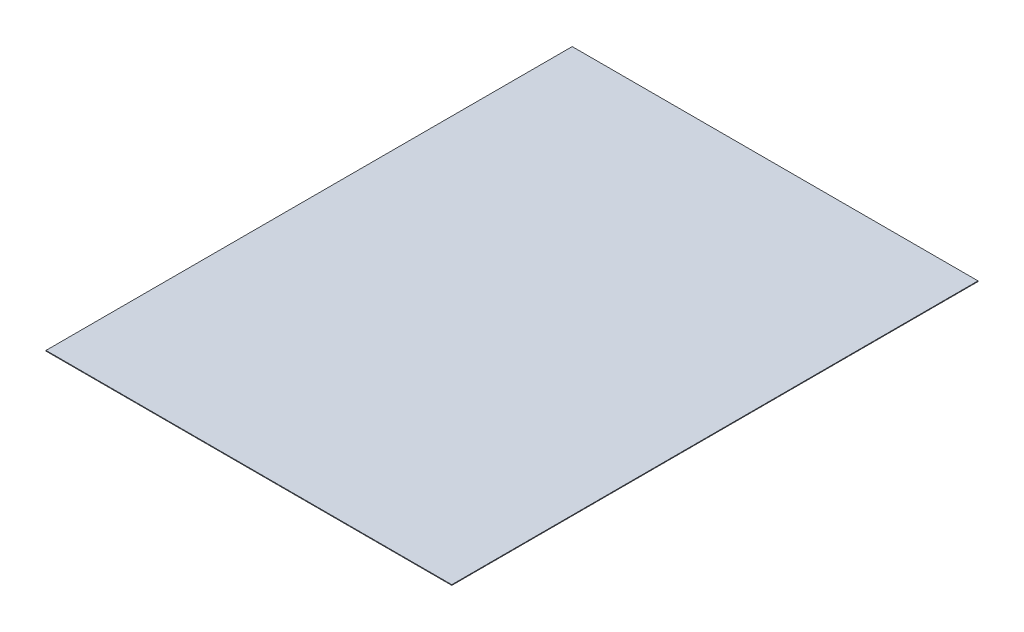
ISO-10303-21;
HEADER;
FILE_DESCRIPTION(('STEP AP214'),'2;1');
FILE_NAME('part.step','',(''),(''),'','','');
FILE_SCHEMA(('AUTOMOTIVE_DESIGN { 1 0 10303 214 1 1 1 1 }'));
ENDSEC;
DATA;
#1=APPLICATION_CONTEXT('core data for automotive mechanical design processes');
#2=APPLICATION_PROTOCOL_DEFINITION('international standard','automotive_design',2000,#1);
#3=PRODUCT_CONTEXT('',#1,'mechanical');
#4=PRODUCT('Part','Part','',(#3));
#5=PRODUCT_RELATED_PRODUCT_CATEGORY('part','',(#4));
#6=PRODUCT_DEFINITION_FORMATION('','',#4);
#7=PRODUCT_DEFINITION_CONTEXT('part definition',#1,'design');
#8=PRODUCT_DEFINITION('design','',#6,#7);
#9=PRODUCT_DEFINITION_SHAPE('','',#8);
#10=(LENGTH_UNIT() NAMED_UNIT(*) SI_UNIT(.MILLI.,.METRE.));
#11=(NAMED_UNIT(*) PLANE_ANGLE_UNIT() SI_UNIT($,.RADIAN.));
#12=(NAMED_UNIT(*) SI_UNIT($,.STERADIAN.) SOLID_ANGLE_UNIT());
#13=UNCERTAINTY_MEASURE_WITH_UNIT(LENGTH_MEASURE(1.E-05),#10,'distance_accuracy_value','');
#14=(GEOMETRIC_REPRESENTATION_CONTEXT(3) GLOBAL_UNCERTAINTY_ASSIGNED_CONTEXT((#13)) GLOBAL_UNIT_ASSIGNED_CONTEXT((#10,
#11,#12)) REPRESENTATION_CONTEXT('',''));
#15=CARTESIAN_POINT('',(0.,0.,0.));
#16=DIRECTION('',(0.,0.,1.));
#17=DIRECTION('',(1.,0.,0.));
#18=AXIS2_PLACEMENT_3D('',#15,#16,#17);
#19=CARTESIAN_POINT('',(42.5,241.5,-797.5));
#20=DIRECTION('',(-1.,0.,0.));
#21=DIRECTION('',(0.,0.,1.));
#22=AXIS2_PLACEMENT_3D('',#19,#20,#21);
#23=PLANE('',#22);
#24=DIRECTION('',(0.,-1.,0.));
#25=VECTOR('',#24,1.);
#26=CARTESIAN_POINT('',(42.5,241.5,0.));
#27=LINE('',#26,#25);
#28=CARTESIAN_POINT('',(42.5,242.5,0.));
#29=VERTEX_POINT('',#28);
#30=CARTESIAN_POINT('',(42.5,241.5,0.));
#31=VERTEX_POINT('',#30);
#32=EDGE_CURVE('E103',#29,#31,#27,.T.);
#33=ORIENTED_EDGE('',*,*,#32,.F.);
#34=DIRECTION('',(0.,0.,1.));
#35=VECTOR('',#34,1.);
#36=CARTESIAN_POINT('',(42.5,242.5,-797.5));
#37=LINE('',#36,#35);
#38=CARTESIAN_POINT('',(42.5,242.5,-797.5));
#39=VERTEX_POINT('',#38);
#40=EDGE_CURVE('E11',#39,#29,#37,.T.);
#41=ORIENTED_EDGE('',*,*,#40,.F.);
#42=DIRECTION('',(0.,-1.,0.));
#43=VECTOR('',#42,1.);
#44=CARTESIAN_POINT('',(42.5,241.5,-797.5));
#45=LINE('',#44,#43);
#46=CARTESIAN_POINT('',(42.5,241.5,-797.5));
#47=VERTEX_POINT('',#46);
#48=EDGE_CURVE('E97',#39,#47,#45,.T.);
#49=ORIENTED_EDGE('',*,*,#48,.T.);
#50=DIRECTION('',(0.,0.,1.));
#51=VECTOR('',#50,1.);
#52=CARTESIAN_POINT('',(42.5,241.5,-797.5));
#53=LINE('',#52,#51);
#54=EDGE_CURVE('E42',#47,#31,#53,.T.);
#55=ORIENTED_EDGE('',*,*,#54,.T.);
#56=EDGE_LOOP('',(#33,#41,#49,#55));
#57=FACE_BOUND('',#56,.T.);
#58=ADVANCED_FACE('F39',(#57),#23,.T.);
#59=CARTESIAN_POINT('',(42.5,242.5,-797.5));
#60=DIRECTION('',(0.,1.,0.));
#61=DIRECTION('',(0.,0.,1.));
#62=AXIS2_PLACEMENT_3D('',#59,#60,#61);
#63=PLANE('',#62);
#64=DIRECTION('',(-1.,0.,0.));
#65=VECTOR('',#64,1.);
#66=CARTESIAN_POINT('',(42.5,242.5,0.));
#67=LINE('',#66,#65);
#68=CARTESIAN_POINT('',(657.5,242.5,0.));
#69=VERTEX_POINT('',#68);
#70=EDGE_CURVE('E99',#69,#29,#67,.T.);
#71=ORIENTED_EDGE('',*,*,#70,.F.);
#72=DIRECTION('',(0.,0.,1.));
#73=VECTOR('',#72,1.);
#74=CARTESIAN_POINT('',(657.5,242.5,-797.5));
#75=LINE('',#74,#73);
#76=CARTESIAN_POINT('',(657.5,242.5,-797.5));
#77=VERTEX_POINT('',#76);
#78=EDGE_CURVE('E48',#77,#69,#75,.T.);
#79=ORIENTED_EDGE('',*,*,#78,.F.);
#80=DIRECTION('',(-1.,0.,0.));
#81=VECTOR('',#80,1.);
#82=CARTESIAN_POINT('',(42.5,242.5,-797.5));
#83=LINE('',#82,#81);
#84=EDGE_CURVE('E94',#77,#39,#83,.T.);
#85=ORIENTED_EDGE('',*,*,#84,.T.);
#86=ORIENTED_EDGE('',*,*,#40,.T.);
#87=EDGE_LOOP('',(#71,#79,#85,#86));
#88=FACE_BOUND('',#87,.T.);
#89=ADVANCED_FACE('F113',(#88),#63,.T.);
#90=CARTESIAN_POINT('',(657.5,241.5,-797.5));
#91=DIRECTION('',(1.,0.,0.));
#92=DIRECTION('',(0.,0.,-1.));
#93=AXIS2_PLACEMENT_3D('',#90,#91,#92);
#94=PLANE('',#93);
#95=DIRECTION('',(0.,1.,0.));
#96=VECTOR('',#95,1.);
#97=CARTESIAN_POINT('',(657.5,241.5,0.));
#98=LINE('',#97,#96);
#99=CARTESIAN_POINT('',(657.5,241.5,0.));
#100=VERTEX_POINT('',#99);
#101=EDGE_CURVE('E89',#100,#69,#98,.T.);
#102=ORIENTED_EDGE('',*,*,#101,.F.);
#103=DIRECTION('',(0.,0.,1.));
#104=VECTOR('',#103,1.);
#105=CARTESIAN_POINT('',(657.5,241.5,-797.5));
#106=LINE('',#105,#104);
#107=CARTESIAN_POINT('',(657.5,241.5,-797.5));
#108=VERTEX_POINT('',#107);
#109=EDGE_CURVE('E84',#108,#100,#106,.T.);
#110=ORIENTED_EDGE('',*,*,#109,.F.);
#111=DIRECTION('',(0.,1.,0.));
#112=VECTOR('',#111,1.);
#113=CARTESIAN_POINT('',(657.5,241.5,-797.5));
#114=LINE('',#113,#112);
#115=EDGE_CURVE('E87',#108,#77,#114,.T.);
#116=ORIENTED_EDGE('',*,*,#115,.T.);
#117=ORIENTED_EDGE('',*,*,#78,.T.);
#118=EDGE_LOOP('',(#102,#110,#116,#117));
#119=FACE_BOUND('',#118,.T.);
#120=ADVANCED_FACE('F86',(#119),#94,.T.);
#121=CARTESIAN_POINT('',(42.5,241.5,-797.5));
#122=DIRECTION('',(0.,-1.,0.));
#123=DIRECTION('',(0.,0.,-1.));
#124=AXIS2_PLACEMENT_3D('',#121,#122,#123);
#125=PLANE('',#124);
#126=DIRECTION('',(1.,0.,0.));
#127=VECTOR('',#126,1.);
#128=CARTESIAN_POINT('',(42.5,241.5,0.));
#129=LINE('',#128,#127);
#130=EDGE_CURVE('E106',#31,#100,#129,.T.);
#131=ORIENTED_EDGE('',*,*,#130,.F.);
#132=ORIENTED_EDGE('',*,*,#54,.F.);
#133=DIRECTION('',(1.,0.,0.));
#134=VECTOR('',#133,1.);
#135=CARTESIAN_POINT('',(42.5,241.5,-797.5));
#136=LINE('',#135,#134);
#137=EDGE_CURVE('E93',#47,#108,#136,.T.);
#138=ORIENTED_EDGE('',*,*,#137,.T.);
#139=ORIENTED_EDGE('',*,*,#109,.T.);
#140=EDGE_LOOP('',(#131,#132,#138,#139));
#141=FACE_BOUND('',#140,.T.);
#142=ADVANCED_FACE('F96',(#141),#125,.T.);
#143=CARTESIAN_POINT('',(0.,0.,-797.5));
#144=DIRECTION('',(0.,0.,-1.));
#145=DIRECTION('',(-1.,0.,0.));
#146=AXIS2_PLACEMENT_3D('',#143,#144,#145);
#147=PLANE('',#146);
#148=ORIENTED_EDGE('',*,*,#48,.F.);
#149=ORIENTED_EDGE('',*,*,#84,.F.);
#150=ORIENTED_EDGE('',*,*,#115,.F.);
#151=ORIENTED_EDGE('',*,*,#137,.F.);
#152=EDGE_LOOP('',(#148,#149,#150,#151));
#153=FACE_BOUND('',#152,.T.);
#154=ADVANCED_FACE('F92',(#153),#147,.T.);
#155=CARTESIAN_POINT('',(0.,0.,0.));
#156=DIRECTION('',(0.,0.,-1.));
#157=DIRECTION('',(-1.,0.,0.));
#158=AXIS2_PLACEMENT_3D('',#155,#156,#157);
#159=PLANE('',#158);
#160=ORIENTED_EDGE('',*,*,#32,.T.);
#161=ORIENTED_EDGE('',*,*,#130,.T.);
#162=ORIENTED_EDGE('',*,*,#101,.T.);
#163=ORIENTED_EDGE('',*,*,#70,.T.);
#164=EDGE_LOOP('',(#160,#161,#162,#163));
#165=FACE_BOUND('',#164,.T.);
#166=ADVANCED_FACE('F112',(#165),#159,.F.);
#167=CLOSED_SHELL('',(#58,#89,#120,#142,#154,#166));
#168=MANIFOLD_SOLID_BREP('B2',#167);
#169=ADVANCED_BREP_SHAPE_REPRESENTATION('',(#18,#168),#14);
#170=SHAPE_DEFINITION_REPRESENTATION(#9,#169);
ENDSEC;
END-ISO-10303-21;
